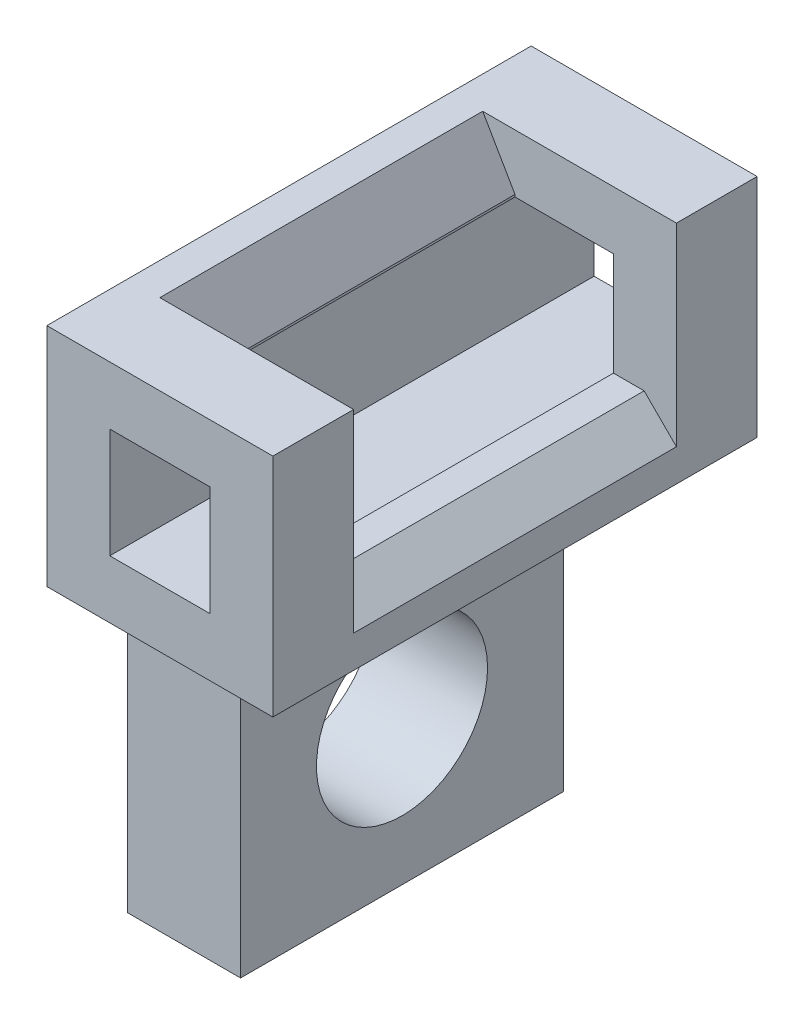
ISO-10303-21;
HEADER;
FILE_DESCRIPTION(('STEP AP214'),'2;1');
FILE_NAME('part.step','',(''),(''),'','','');
FILE_SCHEMA(('AUTOMOTIVE_DESIGN { 1 0 10303 214 1 1 1 1 }'));
ENDSEC;
DATA;
#1=APPLICATION_CONTEXT('core data for automotive mechanical design processes');
#2=APPLICATION_PROTOCOL_DEFINITION('international standard','automotive_design',2000,#1);
#3=PRODUCT_CONTEXT('',#1,'mechanical');
#4=PRODUCT('Part','Part','',(#3));
#5=PRODUCT_RELATED_PRODUCT_CATEGORY('part','',(#4));
#6=PRODUCT_DEFINITION_FORMATION('','',#4);
#7=PRODUCT_DEFINITION_CONTEXT('part definition',#1,'design');
#8=PRODUCT_DEFINITION('design','',#6,#7);
#9=PRODUCT_DEFINITION_SHAPE('','',#8);
#10=(LENGTH_UNIT() NAMED_UNIT(*) SI_UNIT(.MILLI.,.METRE.));
#11=(NAMED_UNIT(*) PLANE_ANGLE_UNIT() SI_UNIT($,.RADIAN.));
#12=(NAMED_UNIT(*) SI_UNIT($,.STERADIAN.) SOLID_ANGLE_UNIT());
#13=UNCERTAINTY_MEASURE_WITH_UNIT(LENGTH_MEASURE(1.E-05),#10,'distance_accuracy_value','');
#14=(GEOMETRIC_REPRESENTATION_CONTEXT(3) GLOBAL_UNCERTAINTY_ASSIGNED_CONTEXT((#13)) GLOBAL_UNIT_ASSIGNED_CONTEXT((#10,
#11,#12)) REPRESENTATION_CONTEXT('',''));
#15=CARTESIAN_POINT('',(0.,0.,0.));
#16=DIRECTION('',(0.,0.,1.));
#17=DIRECTION('',(1.,0.,0.));
#18=AXIS2_PLACEMENT_3D('',#15,#16,#17);
#19=CARTESIAN_POINT('',(-3.5,-3.5,15.));
#20=DIRECTION('',(0.,1.,0.));
#21=DIRECTION('',(0.,0.,1.));
#22=AXIS2_PLACEMENT_3D('',#19,#20,#21);
#23=PLANE('',#22);
#24=DIRECTION('',(0.,0.,-1.));
#25=VECTOR('',#24,1.);
#26=CARTESIAN_POINT('',(0.999999999999997,-3.5,2.5));
#27=LINE('',#26,#25);
#28=CARTESIAN_POINT('',(0.999999999999995,-3.5,13.5));
#29=VERTEX_POINT('',#28);
#30=CARTESIAN_POINT('',(0.999999999999997,-3.5,1.50000000000001));
#31=VERTEX_POINT('',#30);
#32=EDGE_CURVE('E390',#29,#31,#27,.T.);
#33=ORIENTED_EDGE('',*,*,#32,.T.);
#34=DIRECTION('',(-1.,0.,0.));
#35=VECTOR('',#34,1.);
#36=CARTESIAN_POINT('',(-3.5,-3.5,1.50000000000001));
#37=LINE('',#36,#35);
#38=CARTESIAN_POINT('',(-3.5,-3.5,1.50000000000001));
#39=VERTEX_POINT('',#38);
#40=EDGE_CURVE('E393',#31,#39,#37,.T.);
#41=ORIENTED_EDGE('',*,*,#40,.T.);
#42=DIRECTION('',(0.,0.,-1.));
#43=VECTOR('',#42,1.);
#44=CARTESIAN_POINT('',(-3.5,-3.5,15.));
#45=LINE('',#44,#43);
#46=CARTESIAN_POINT('',(-3.5,-3.5,0.));
#47=VERTEX_POINT('',#46);
#48=EDGE_CURVE('E340',#39,#47,#45,.T.);
#49=ORIENTED_EDGE('',*,*,#48,.T.);
#50=DIRECTION('',(1.,0.,0.));
#51=VECTOR('',#50,1.);
#52=CARTESIAN_POINT('',(-3.5,-3.5,0.));
#53=LINE('',#52,#51);
#54=CARTESIAN_POINT('',(3.5,-3.5,0.));
#55=VERTEX_POINT('',#54);
#56=EDGE_CURVE('E316',#47,#55,#53,.T.);
#57=ORIENTED_EDGE('',*,*,#56,.T.);
#58=DIRECTION('',(0.,0.,-1.));
#59=VECTOR('',#58,1.);
#60=CARTESIAN_POINT('',(3.5,-3.5,15.));
#61=LINE('',#60,#59);
#62=CARTESIAN_POINT('',(3.5,-3.5,15.));
#63=VERTEX_POINT('',#62);
#64=EDGE_CURVE('E325',#63,#55,#61,.T.);
#65=ORIENTED_EDGE('',*,*,#64,.F.);
#66=DIRECTION('',(1.,0.,0.));
#67=VECTOR('',#66,1.);
#68=CARTESIAN_POINT('',(-3.5,-3.5,15.));
#69=LINE('',#68,#67);
#70=CARTESIAN_POINT('',(-3.5,-3.5,15.));
#71=VERTEX_POINT('',#70);
#72=EDGE_CURVE('E322',#71,#63,#69,.T.);
#73=ORIENTED_EDGE('',*,*,#72,.F.);
#74=CARTESIAN_POINT('',(-3.5,-3.5,13.5));
#75=VERTEX_POINT('',#74);
#76=EDGE_CURVE('E341',#71,#75,#45,.T.);
#77=ORIENTED_EDGE('',*,*,#76,.T.);
#78=DIRECTION('',(1.,0.,0.));
#79=VECTOR('',#78,1.);
#80=CARTESIAN_POINT('',(0.,-3.5,13.5));
#81=LINE('',#80,#79);
#82=EDGE_CURVE('E387',#75,#29,#81,.T.);
#83=ORIENTED_EDGE('',*,*,#82,.T.);
#84=EDGE_LOOP('',(#33,#41,#49,#57,#65,#73,#77,#83));
#85=FACE_BOUND('',#84,.T.);
#86=ADVANCED_FACE('F44',(#85),#23,.F.);
#87=CARTESIAN_POINT('',(3.5,3.5,15.));
#88=DIRECTION('',(-1.,0.,0.));
#89=DIRECTION('',(0.,-1.,0.));
#90=AXIS2_PLACEMENT_3D('',#87,#88,#89);
#91=PLANE('',#90);
#92=DIRECTION('',(0.,1.,0.));
#93=VECTOR('',#92,1.);
#94=CARTESIAN_POINT('',(3.5,-1.5,2.5));
#95=LINE('',#94,#93);
#96=CARTESIAN_POINT('',(3.5,-2.5,2.5));
#97=VERTEX_POINT('',#96);
#98=CARTESIAN_POINT('',(3.5,3.5,2.5));
#99=VERTEX_POINT('',#98);
#100=EDGE_CURVE('E61',#97,#99,#95,.T.);
#101=ORIENTED_EDGE('',*,*,#100,.F.);
#102=DIRECTION('',(0.,0.,1.));
#103=VECTOR('',#102,1.);
#104=CARTESIAN_POINT('',(3.5,-2.5,12.5));
#105=LINE('',#104,#103);
#106=CARTESIAN_POINT('',(3.5,-2.5,12.5));
#107=VERTEX_POINT('',#106);
#108=EDGE_CURVE('E418',#97,#107,#105,.T.);
#109=ORIENTED_EDGE('',*,*,#108,.T.);
#110=DIRECTION('',(0.,1.,0.));
#111=VECTOR('',#110,1.);
#112=CARTESIAN_POINT('',(3.5,-1.5,12.5));
#113=LINE('',#112,#111);
#114=CARTESIAN_POINT('',(3.5,3.5,12.5));
#115=VERTEX_POINT('',#114);
#116=EDGE_CURVE('E68',#107,#115,#113,.T.);
#117=ORIENTED_EDGE('',*,*,#116,.T.);
#118=DIRECTION('',(0.,0.,-1.));
#119=VECTOR('',#118,1.);
#120=CARTESIAN_POINT('',(3.5,3.5,15.));
#121=LINE('',#120,#119);
#122=CARTESIAN_POINT('',(3.5,3.5,15.));
#123=VERTEX_POINT('',#122);
#124=EDGE_CURVE('E350',#123,#115,#121,.T.);
#125=ORIENTED_EDGE('',*,*,#124,.F.);
#126=DIRECTION('',(0.,1.,0.));
#127=VECTOR('',#126,1.);
#128=CARTESIAN_POINT('',(3.5,3.5,15.));
#129=LINE('',#128,#127);
#130=EDGE_CURVE('E311',#63,#123,#129,.T.);
#131=ORIENTED_EDGE('',*,*,#130,.F.);
#132=ORIENTED_EDGE('',*,*,#64,.T.);
#133=DIRECTION('',(0.,1.,0.));
#134=VECTOR('',#133,1.);
#135=CARTESIAN_POINT('',(3.5,3.5,0.));
#136=LINE('',#135,#134);
#137=CARTESIAN_POINT('',(3.5,3.5,0.));
#138=VERTEX_POINT('',#137);
#139=EDGE_CURVE('E300',#55,#138,#136,.T.);
#140=ORIENTED_EDGE('',*,*,#139,.T.);
#141=EDGE_CURVE('E349',#99,#138,#121,.T.);
#142=ORIENTED_EDGE('',*,*,#141,.F.);
#143=EDGE_LOOP('',(#101,#109,#117,#125,#131,#132,#140,#142));
#144=FACE_BOUND('',#143,.T.);
#145=ADVANCED_FACE('F430',(#144),#91,.F.);
#146=CARTESIAN_POINT('',(-3.5,3.5,15.));
#147=DIRECTION('',(0.,-1.,0.));
#148=DIRECTION('',(0.,0.,-1.));
#149=AXIS2_PLACEMENT_3D('',#146,#147,#148);
#150=PLANE('',#149);
#151=DIRECTION('',(1.,0.,0.));
#152=VECTOR('',#151,1.);
#153=CARTESIAN_POINT('',(-1.5,3.5,12.5));
#154=LINE('',#153,#152);
#155=CARTESIAN_POINT('',(-2.5,3.5,12.5));
#156=VERTEX_POINT('',#155);
#157=EDGE_CURVE('E229',#156,#115,#154,.T.);
#158=ORIENTED_EDGE('',*,*,#157,.F.);
#159=DIRECTION('',(0.,0.,-1.));
#160=VECTOR('',#159,1.);
#161=CARTESIAN_POINT('',(-2.5,3.5,15.));
#162=LINE('',#161,#160);
#163=CARTESIAN_POINT('',(-2.5,3.5,2.5));
#164=VERTEX_POINT('',#163);
#165=EDGE_CURVE('E373',#156,#164,#162,.T.);
#166=ORIENTED_EDGE('',*,*,#165,.T.);
#167=DIRECTION('',(-1.,0.,0.));
#168=VECTOR('',#167,1.);
#169=CARTESIAN_POINT('',(-1.5,3.5,2.5));
#170=LINE('',#169,#168);
#171=EDGE_CURVE('E225',#99,#164,#170,.T.);
#172=ORIENTED_EDGE('',*,*,#171,.F.);
#173=ORIENTED_EDGE('',*,*,#141,.T.);
#174=DIRECTION('',(-1.,0.,0.));
#175=VECTOR('',#174,1.);
#176=CARTESIAN_POINT('',(-3.5,3.5,0.));
#177=LINE('',#176,#175);
#178=CARTESIAN_POINT('',(-3.5,3.5,0.));
#179=VERTEX_POINT('',#178);
#180=EDGE_CURVE('E329',#138,#179,#177,.T.);
#181=ORIENTED_EDGE('',*,*,#180,.T.);
#182=DIRECTION('',(0.,0.,-1.));
#183=VECTOR('',#182,1.);
#184=CARTESIAN_POINT('',(-3.5,3.5,15.));
#185=LINE('',#184,#183);
#186=CARTESIAN_POINT('',(-3.5,3.5,15.));
#187=VERTEX_POINT('',#186);
#188=EDGE_CURVE('E345',#187,#179,#185,.T.);
#189=ORIENTED_EDGE('',*,*,#188,.F.);
#190=DIRECTION('',(-1.,0.,0.));
#191=VECTOR('',#190,1.);
#192=CARTESIAN_POINT('',(-3.5,3.5,15.));
#193=LINE('',#192,#191);
#194=EDGE_CURVE('E315',#123,#187,#193,.T.);
#195=ORIENTED_EDGE('',*,*,#194,.F.);
#196=ORIENTED_EDGE('',*,*,#124,.T.);
#197=EDGE_LOOP('',(#158,#166,#172,#173,#181,#189,#195,#196));
#198=FACE_BOUND('',#197,.T.);
#199=ADVANCED_FACE('F434',(#198),#150,.F.);
#200=CARTESIAN_POINT('',(-3.5,3.5,15.));
#201=DIRECTION('',(1.,0.,0.));
#202=DIRECTION('',(0.,1.,0.));
#203=AXIS2_PLACEMENT_3D('',#200,#201,#202);
#204=PLANE('',#203);
#205=CARTESIAN_POINT('',(-3.5,-9.,7.5));
#206=DIRECTION('',(1.,0.,0.));
#207=DIRECTION('',(0.,1.,0.));
#208=AXIS2_PLACEMENT_3D('',#205,#206,#207);
#209=CIRCLE('',#208,2.65);
#210=CARTESIAN_POINT('',(-3.5,-6.35,7.5));
#211=VERTEX_POINT('',#210);
#212=EDGE_CURVE('E411',#211,#211,#209,.T.);
#213=ORIENTED_EDGE('',*,*,#212,.T.);
#214=EDGE_LOOP('',(#213));
#215=FACE_BOUND('',#214,.T.);
#216=DIRECTION('',(0.,-1.,0.));
#217=VECTOR('',#216,1.);
#218=CARTESIAN_POINT('',(-3.5,3.5,0.));
#219=LINE('',#218,#217);
#220=EDGE_CURVE('E332',#179,#47,#219,.T.);
#221=ORIENTED_EDGE('',*,*,#220,.T.);
#222=ORIENTED_EDGE('',*,*,#48,.F.);
#223=DIRECTION('',(0.,0.707106781186551,-0.707106781186544));
#224=VECTOR('',#223,1.);
#225=CARTESIAN_POINT('',(-3.5,-6.74999999999996,4.74999999999994));
#226=LINE('',#225,#224);
#227=CARTESIAN_POINT('',(-3.5,-4.5,2.5));
#228=VERTEX_POINT('',#227);
#229=EDGE_CURVE('E223',#39,#228,#226,.F.);
#230=ORIENTED_EDGE('',*,*,#229,.T.);
#231=DIRECTION('',(0.,1.,0.));
#232=VECTOR('',#231,1.);
#233=CARTESIAN_POINT('',(-3.5,-13.5,2.5));
#234=LINE('',#233,#232);
#235=CARTESIAN_POINT('',(-3.5,-13.5,2.5));
#236=VERTEX_POINT('',#235);
#237=EDGE_CURVE('E199',#236,#228,#234,.T.);
#238=ORIENTED_EDGE('',*,*,#237,.F.);
#239=DIRECTION('',(0.,0.,-1.));
#240=VECTOR('',#239,1.);
#241=CARTESIAN_POINT('',(-3.5,-13.5,12.5));
#242=LINE('',#241,#240);
#243=CARTESIAN_POINT('',(-3.5,-13.5,12.5));
#244=VERTEX_POINT('',#243);
#245=EDGE_CURVE('E207',#244,#236,#242,.T.);
#246=ORIENTED_EDGE('',*,*,#245,.F.);
#247=DIRECTION('',(0.,1.,0.));
#248=VECTOR('',#247,1.);
#249=CARTESIAN_POINT('',(-3.5,-13.5,12.5));
#250=LINE('',#249,#248);
#251=CARTESIAN_POINT('',(-3.5,-4.5,12.5));
#252=VERTEX_POINT('',#251);
#253=EDGE_CURVE('E771',#244,#252,#250,.T.);
#254=ORIENTED_EDGE('',*,*,#253,.T.);
#255=DIRECTION('',(0.,-0.707106781186551,-0.707106781186544));
#256=VECTOR('',#255,1.);
#257=CARTESIAN_POINT('',(-3.5,0.750000000000039,17.75));
#258=LINE('',#257,#256);
#259=EDGE_CURVE('E404',#252,#75,#258,.F.);
#260=ORIENTED_EDGE('',*,*,#259,.T.);
#261=ORIENTED_EDGE('',*,*,#76,.F.);
#262=DIRECTION('',(0.,-1.,0.));
#263=VECTOR('',#262,1.);
#264=CARTESIAN_POINT('',(-3.5,3.5,15.));
#265=LINE('',#264,#263);
#266=EDGE_CURVE('E319',#187,#71,#265,.T.);
#267=ORIENTED_EDGE('',*,*,#266,.F.);
#268=ORIENTED_EDGE('',*,*,#188,.T.);
#269=EDGE_LOOP('',(#221,#222,#230,#238,#246,#254,#260,#261,#267,#268));
#270=FACE_BOUND('',#269,.T.);
#271=ADVANCED_FACE('F220',(#215,#270),#204,.F.);
#272=CARTESIAN_POINT('',(0.,0.,15.));
#273=DIRECTION('',(0.,0.,1.));
#274=DIRECTION('',(1.,0.,0.));
#275=AXIS2_PLACEMENT_3D('',#272,#273,#274);
#276=PLANE('',#275);
#277=DIRECTION('',(0.,1.,0.));
#278=VECTOR('',#277,1.);
#279=CARTESIAN_POINT('',(1.55,1.7,15.));
#280=LINE('',#279,#278);
#281=CARTESIAN_POINT('',(1.55,-1.7,15.));
#282=VERTEX_POINT('',#281);
#283=CARTESIAN_POINT('',(1.55,1.7,15.));
#284=VERTEX_POINT('',#283);
#285=EDGE_CURVE('E264',#282,#284,#280,.T.);
#286=ORIENTED_EDGE('',*,*,#285,.F.);
#287=DIRECTION('',(1.,0.,0.));
#288=VECTOR('',#287,1.);
#289=CARTESIAN_POINT('',(-1.55,-1.7,15.));
#290=LINE('',#289,#288);
#291=CARTESIAN_POINT('',(-1.55,-1.7,15.));
#292=VERTEX_POINT('',#291);
#293=EDGE_CURVE('E270',#292,#282,#290,.T.);
#294=ORIENTED_EDGE('',*,*,#293,.F.);
#295=DIRECTION('',(0.,-1.,0.));
#296=VECTOR('',#295,1.);
#297=CARTESIAN_POINT('',(-1.55,1.7,15.));
#298=LINE('',#297,#296);
#299=CARTESIAN_POINT('',(-1.55,1.7,15.));
#300=VERTEX_POINT('',#299);
#301=EDGE_CURVE('E290',#300,#292,#298,.T.);
#302=ORIENTED_EDGE('',*,*,#301,.F.);
#303=DIRECTION('',(-1.,0.,0.));
#304=VECTOR('',#303,1.);
#305=CARTESIAN_POINT('',(-1.55,1.7,15.));
#306=LINE('',#305,#304);
#307=EDGE_CURVE('E286',#284,#300,#306,.T.);
#308=ORIENTED_EDGE('',*,*,#307,.F.);
#309=EDGE_LOOP('',(#286,#294,#302,#308));
#310=FACE_BOUND('',#309,.T.);
#311=ORIENTED_EDGE('',*,*,#130,.T.);
#312=ORIENTED_EDGE('',*,*,#194,.T.);
#313=ORIENTED_EDGE('',*,*,#266,.T.);
#314=ORIENTED_EDGE('',*,*,#72,.T.);
#315=EDGE_LOOP('',(#311,#312,#313,#314));
#316=FACE_BOUND('',#315,.T.);
#317=ADVANCED_FACE('F438',(#310,#316),#276,.T.);
#318=CARTESIAN_POINT('',(0.,0.,0.));
#319=DIRECTION('',(0.,0.,1.));
#320=DIRECTION('',(1.,0.,0.));
#321=AXIS2_PLACEMENT_3D('',#318,#319,#320);
#322=PLANE('',#321);
#323=DIRECTION('',(1.,0.,0.));
#324=VECTOR('',#323,1.);
#325=CARTESIAN_POINT('',(-1.55,-1.7,0.));
#326=LINE('',#325,#324);
#327=CARTESIAN_POINT('',(-1.55,-1.7,0.));
#328=VERTEX_POINT('',#327);
#329=CARTESIAN_POINT('',(1.55,-1.7,0.));
#330=VERTEX_POINT('',#329);
#331=EDGE_CURVE('E278',#328,#330,#326,.T.);
#332=ORIENTED_EDGE('',*,*,#331,.T.);
#333=DIRECTION('',(0.,1.,0.));
#334=VECTOR('',#333,1.);
#335=CARTESIAN_POINT('',(1.55,1.7,0.));
#336=LINE('',#335,#334);
#337=CARTESIAN_POINT('',(1.55,1.7,0.));
#338=VERTEX_POINT('',#337);
#339=EDGE_CURVE('E265',#330,#338,#336,.T.);
#340=ORIENTED_EDGE('',*,*,#339,.T.);
#341=DIRECTION('',(-1.,0.,0.));
#342=VECTOR('',#341,1.);
#343=CARTESIAN_POINT('',(-1.55,1.7,0.));
#344=LINE('',#343,#342);
#345=CARTESIAN_POINT('',(-1.55,1.7,0.));
#346=VERTEX_POINT('',#345);
#347=EDGE_CURVE('E269',#338,#346,#344,.T.);
#348=ORIENTED_EDGE('',*,*,#347,.T.);
#349=DIRECTION('',(0.,-1.,0.));
#350=VECTOR('',#349,1.);
#351=CARTESIAN_POINT('',(-1.55,1.7,0.));
#352=LINE('',#351,#350);
#353=EDGE_CURVE('E274',#346,#328,#352,.T.);
#354=ORIENTED_EDGE('',*,*,#353,.T.);
#355=EDGE_LOOP('',(#332,#340,#348,#354));
#356=FACE_BOUND('',#355,.T.);
#357=ORIENTED_EDGE('',*,*,#139,.F.);
#358=ORIENTED_EDGE('',*,*,#56,.F.);
#359=ORIENTED_EDGE('',*,*,#220,.F.);
#360=ORIENTED_EDGE('',*,*,#180,.F.);
#361=EDGE_LOOP('',(#357,#358,#359,#360));
#362=FACE_BOUND('',#361,.T.);
#363=ADVANCED_FACE('F446',(#356,#362),#322,.F.);
#364=CARTESIAN_POINT('',(1.55,1.7,0.));
#365=DIRECTION('',(1.,0.,0.));
#366=DIRECTION('',(0.,1.,0.));
#367=AXIS2_PLACEMENT_3D('',#364,#365,#366);
#368=PLANE('',#367);
#369=DIRECTION('',(0.,0.,1.));
#370=VECTOR('',#369,1.);
#371=CARTESIAN_POINT('',(1.55,1.7,0.));
#372=LINE('',#371,#370);
#373=CARTESIAN_POINT('',(1.55,1.7,12.5));
#374=VERTEX_POINT('',#373);
#375=EDGE_CURVE('E282',#374,#284,#372,.T.);
#376=ORIENTED_EDGE('',*,*,#375,.F.);
#377=DIRECTION('',(0.,-1.,0.));
#378=VECTOR('',#377,1.);
#379=CARTESIAN_POINT('',(1.55,1.7,12.5));
#380=LINE('',#379,#378);
#381=CARTESIAN_POINT('',(1.55,-1.5,12.5));
#382=VERTEX_POINT('',#381);
#383=EDGE_CURVE('E260',#374,#382,#380,.T.);
#384=ORIENTED_EDGE('',*,*,#383,.T.);
#385=DIRECTION('',(0.,0.,1.));
#386=VECTOR('',#385,1.);
#387=CARTESIAN_POINT('',(1.55,-1.5,0.));
#388=LINE('',#387,#386);
#389=CARTESIAN_POINT('',(1.55,-1.5,2.5));
#390=VERTEX_POINT('',#389);
#391=EDGE_CURVE('E366',#390,#382,#388,.T.);
#392=ORIENTED_EDGE('',*,*,#391,.F.);
#393=DIRECTION('',(0.,1.,0.));
#394=VECTOR('',#393,1.);
#395=CARTESIAN_POINT('',(1.55,1.7,2.5));
#396=LINE('',#395,#394);
#397=CARTESIAN_POINT('',(1.55,1.7,2.5));
#398=VERTEX_POINT('',#397);
#399=EDGE_CURVE('E246',#390,#398,#396,.T.);
#400=ORIENTED_EDGE('',*,*,#399,.T.);
#401=EDGE_CURVE('E307',#338,#398,#372,.T.);
#402=ORIENTED_EDGE('',*,*,#401,.F.);
#403=ORIENTED_EDGE('',*,*,#339,.F.);
#404=DIRECTION('',(0.,0.,1.));
#405=VECTOR('',#404,1.);
#406=CARTESIAN_POINT('',(1.55,-1.7,0.));
#407=LINE('',#406,#405);
#408=EDGE_CURVE('E297',#330,#282,#407,.T.);
#409=ORIENTED_EDGE('',*,*,#408,.T.);
#410=ORIENTED_EDGE('',*,*,#285,.T.);
#411=EDGE_LOOP('',(#376,#384,#392,#400,#402,#403,#409,#410));
#412=FACE_BOUND('',#411,.T.);
#413=ADVANCED_FACE('F514',(#412),#368,.F.);
#414=CARTESIAN_POINT('',(-1.55,-1.7,0.));
#415=DIRECTION('',(0.,-1.,0.));
#416=DIRECTION('',(0.,0.,-1.));
#417=AXIS2_PLACEMENT_3D('',#414,#415,#416);
#418=PLANE('',#417);
#419=ORIENTED_EDGE('',*,*,#293,.T.);
#420=ORIENTED_EDGE('',*,*,#408,.F.);
#421=ORIENTED_EDGE('',*,*,#331,.F.);
#422=DIRECTION('',(0.,0.,1.));
#423=VECTOR('',#422,1.);
#424=CARTESIAN_POINT('',(-1.55,-1.7,0.));
#425=LINE('',#424,#423);
#426=EDGE_CURVE('E301',#328,#292,#425,.T.);
#427=ORIENTED_EDGE('',*,*,#426,.T.);
#428=EDGE_LOOP('',(#419,#420,#421,#427));
#429=FACE_BOUND('',#428,.T.);
#430=ADVANCED_FACE('F550',(#429),#418,.F.);
#431=CARTESIAN_POINT('',(-1.55,1.7,0.));
#432=DIRECTION('',(-1.,0.,0.));
#433=DIRECTION('',(0.,-1.,0.));
#434=AXIS2_PLACEMENT_3D('',#431,#432,#433);
#435=PLANE('',#434);
#436=ORIENTED_EDGE('',*,*,#301,.T.);
#437=ORIENTED_EDGE('',*,*,#426,.F.);
#438=ORIENTED_EDGE('',*,*,#353,.F.);
#439=DIRECTION('',(0.,0.,1.));
#440=VECTOR('',#439,1.);
#441=CARTESIAN_POINT('',(-1.55,1.7,0.));
#442=LINE('',#441,#440);
#443=EDGE_CURVE('E304',#346,#300,#442,.T.);
#444=ORIENTED_EDGE('',*,*,#443,.T.);
#445=EDGE_LOOP('',(#436,#437,#438,#444));
#446=FACE_BOUND('',#445,.T.);
#447=ADVANCED_FACE('F519',(#446),#435,.F.);
#448=CARTESIAN_POINT('',(-1.55,1.7,0.));
#449=DIRECTION('',(0.,1.,0.));
#450=DIRECTION('',(0.,0.,1.));
#451=AXIS2_PLACEMENT_3D('',#448,#449,#450);
#452=PLANE('',#451);
#453=DIRECTION('',(0.,0.,1.));
#454=VECTOR('',#453,1.);
#455=CARTESIAN_POINT('',(-1.5,1.7,0.));
#456=LINE('',#455,#454);
#457=CARTESIAN_POINT('',(-1.5,1.7,2.5));
#458=VERTEX_POINT('',#457);
#459=CARTESIAN_POINT('',(-1.5,1.7,12.5));
#460=VERTEX_POINT('',#459);
#461=EDGE_CURVE('E358',#458,#460,#456,.T.);
#462=ORIENTED_EDGE('',*,*,#461,.T.);
#463=DIRECTION('',(1.,0.,0.));
#464=VECTOR('',#463,1.);
#465=CARTESIAN_POINT('',(-1.55,1.7,12.5));
#466=LINE('',#465,#464);
#467=EDGE_CURVE('E362',#460,#374,#466,.T.);
#468=ORIENTED_EDGE('',*,*,#467,.T.);
#469=ORIENTED_EDGE('',*,*,#375,.T.);
#470=ORIENTED_EDGE('',*,*,#307,.T.);
#471=ORIENTED_EDGE('',*,*,#443,.F.);
#472=ORIENTED_EDGE('',*,*,#347,.F.);
#473=ORIENTED_EDGE('',*,*,#401,.T.);
#474=DIRECTION('',(-1.,0.,0.));
#475=VECTOR('',#474,1.);
#476=CARTESIAN_POINT('',(-1.55,1.7,2.5));
#477=LINE('',#476,#475);
#478=EDGE_CURVE('E354',#398,#458,#477,.T.);
#479=ORIENTED_EDGE('',*,*,#478,.T.);
#480=EDGE_LOOP('',(#462,#468,#469,#470,#471,#472,#473,#479));
#481=FACE_BOUND('',#480,.T.);
#482=ADVANCED_FACE('F508',(#481),#452,.F.);
#483=CARTESIAN_POINT('',(0.,-1.5,0.));
#484=DIRECTION('',(0.,1.,0.));
#485=DIRECTION('',(0.,0.,1.));
#486=AXIS2_PLACEMENT_3D('',#483,#484,#485);
#487=PLANE('',#486);
#488=DIRECTION('',(1.,0.,0.));
#489=VECTOR('',#488,1.);
#490=CARTESIAN_POINT('',(-1.5,-1.5,12.5));
#491=LINE('',#490,#489);
#492=CARTESIAN_POINT('',(2.5,-1.5,12.5));
#493=VERTEX_POINT('',#492);
#494=EDGE_CURVE('E238',#382,#493,#491,.T.);
#495=ORIENTED_EDGE('',*,*,#494,.T.);
#496=DIRECTION('',(0.,0.,-1.));
#497=VECTOR('',#496,1.);
#498=CARTESIAN_POINT('',(2.5,-1.5,2.5));
#499=LINE('',#498,#497);
#500=CARTESIAN_POINT('',(2.5,-1.5,2.5));
#501=VERTEX_POINT('',#500);
#502=EDGE_CURVE('E407',#493,#501,#499,.T.);
#503=ORIENTED_EDGE('',*,*,#502,.T.);
#504=DIRECTION('',(-1.,0.,0.));
#505=VECTOR('',#504,1.);
#506=CARTESIAN_POINT('',(-1.5,-1.5,2.5));
#507=LINE('',#506,#505);
#508=EDGE_CURVE('E235',#501,#390,#507,.T.);
#509=ORIENTED_EDGE('',*,*,#508,.T.);
#510=ORIENTED_EDGE('',*,*,#391,.T.);
#511=EDGE_LOOP('',(#495,#503,#509,#510));
#512=FACE_BOUND('',#511,.T.);
#513=ADVANCED_FACE('F534',(#512),#487,.T.);
#514=CARTESIAN_POINT('',(-1.5,-1.5,12.5));
#515=DIRECTION('',(0.,0.,1.));
#516=DIRECTION('',(1.,0.,0.));
#517=AXIS2_PLACEMENT_3D('',#514,#515,#516);
#518=PLANE('',#517);
#519=ORIENTED_EDGE('',*,*,#467,.F.);
#520=DIRECTION('',(0.,1.,0.));
#521=VECTOR('',#520,1.);
#522=CARTESIAN_POINT('',(-1.5,-1.5,12.5));
#523=LINE('',#522,#521);
#524=CARTESIAN_POINT('',(-1.5,1.76794919243112,12.5));
#525=VERTEX_POINT('',#524);
#526=EDGE_CURVE('E247',#460,#525,#523,.T.);
#527=ORIENTED_EDGE('',*,*,#526,.T.);
#528=DIRECTION('',(0.500000000000001,-0.866025403784438,0.));
#529=VECTOR('',#528,1.);
#530=CARTESIAN_POINT('',(-0.0849364905389002,-0.683012701892216,12.5));
#531=LINE('',#530,#529);
#532=EDGE_CURVE('E377',#525,#156,#531,.F.);
#533=ORIENTED_EDGE('',*,*,#532,.T.);
#534=ORIENTED_EDGE('',*,*,#157,.T.);
#535=ORIENTED_EDGE('',*,*,#116,.F.);
#536=DIRECTION('',(-0.707106781186546,0.707106781186549,0.));
#537=VECTOR('',#536,1.);
#538=CARTESIAN_POINT('',(0.500000000000008,0.500000000000001,12.5));
#539=LINE('',#538,#537);
#540=EDGE_CURVE('E11',#107,#493,#539,.T.);
#541=ORIENTED_EDGE('',*,*,#540,.T.);
#542=ORIENTED_EDGE('',*,*,#494,.F.);
#543=ORIENTED_EDGE('',*,*,#383,.F.);
#544=EDGE_LOOP('',(#519,#527,#533,#534,#535,#541,#542,#543));
#545=FACE_BOUND('',#544,.T.);
#546=ADVANCED_FACE('F530',(#545),#518,.F.);
#547=CARTESIAN_POINT('',(-1.5,-1.5,2.5));
#548=DIRECTION('',(-1.,0.,0.));
#549=DIRECTION('',(0.,0.,1.));
#550=AXIS2_PLACEMENT_3D('',#547,#548,#549);
#551=PLANE('',#550);
#552=DIRECTION('',(0.,1.,0.));
#553=VECTOR('',#552,1.);
#554=CARTESIAN_POINT('',(-1.5,-1.5,2.5));
#555=LINE('',#554,#553);
#556=CARTESIAN_POINT('',(-1.5,1.76794919243112,2.5));
#557=VERTEX_POINT('',#556);
#558=EDGE_CURVE('E251',#458,#557,#555,.T.);
#559=ORIENTED_EDGE('',*,*,#558,.T.);
#560=DIRECTION('',(0.,0.,1.));
#561=VECTOR('',#560,1.);
#562=CARTESIAN_POINT('',(-1.5,1.76794919243112,2.5));
#563=LINE('',#562,#561);
#564=EDGE_CURVE('E369',#557,#525,#563,.T.);
#565=ORIENTED_EDGE('',*,*,#564,.T.);
#566=ORIENTED_EDGE('',*,*,#526,.F.);
#567=ORIENTED_EDGE('',*,*,#461,.F.);
#568=EDGE_LOOP('',(#559,#565,#566,#567));
#569=FACE_BOUND('',#568,.T.);
#570=ADVANCED_FACE('F529',(#569),#551,.F.);
#571=CARTESIAN_POINT('',(-1.5,-1.5,2.5));
#572=DIRECTION('',(0.,0.,-1.));
#573=DIRECTION('',(-1.,0.,0.));
#574=AXIS2_PLACEMENT_3D('',#571,#572,#573);
#575=PLANE('',#574);
#576=ORIENTED_EDGE('',*,*,#508,.F.);
#577=DIRECTION('',(0.707106781186546,-0.707106781186549,0.));
#578=VECTOR('',#577,1.);
#579=CARTESIAN_POINT('',(0.500000000000008,0.500000000000001,2.5));
#580=LINE('',#579,#578);
#581=EDGE_CURVE('E54',#501,#97,#580,.T.);
#582=ORIENTED_EDGE('',*,*,#581,.T.);
#583=ORIENTED_EDGE('',*,*,#100,.T.);
#584=ORIENTED_EDGE('',*,*,#171,.T.);
#585=DIRECTION('',(-0.500000000000001,0.866025403784438,0.));
#586=VECTOR('',#585,1.);
#587=CARTESIAN_POINT('',(-0.0849364905389002,-0.683012701892216,2.5));
#588=LINE('',#587,#586);
#589=EDGE_CURVE('E381',#164,#557,#588,.F.);
#590=ORIENTED_EDGE('',*,*,#589,.T.);
#591=ORIENTED_EDGE('',*,*,#558,.F.);
#592=ORIENTED_EDGE('',*,*,#478,.F.);
#593=ORIENTED_EDGE('',*,*,#399,.F.);
#594=EDGE_LOOP('',(#576,#582,#583,#584,#590,#591,#592,#593));
#595=FACE_BOUND('',#594,.T.);
#596=ADVANCED_FACE('F424',(#595),#575,.F.);
#597=CARTESIAN_POINT('',(-1.5,1.76794919243112,2.5));
#598=DIRECTION('',(-0.866025403784438,-0.500000000000001,0.));
#599=DIRECTION('',(0.,0.,1.));
#600=AXIS2_PLACEMENT_3D('',#597,#598,#599);
#601=PLANE('',#600);
#602=ORIENTED_EDGE('',*,*,#589,.F.);
#603=ORIENTED_EDGE('',*,*,#165,.F.);
#604=ORIENTED_EDGE('',*,*,#532,.F.);
#605=ORIENTED_EDGE('',*,*,#564,.F.);
#606=EDGE_LOOP('',(#602,#603,#604,#605));
#607=FACE_BOUND('',#606,.T.);
#608=ADVANCED_FACE('F469',(#607),#601,.F.);
#609=CARTESIAN_POINT('',(-3.5,-13.5,2.5));
#610=DIRECTION('',(0.,0.,1.));
#611=DIRECTION('',(1.,0.,0.));
#612=AXIS2_PLACEMENT_3D('',#609,#610,#611);
#613=PLANE('',#612);
#614=ORIENTED_EDGE('',*,*,#237,.T.);
#615=DIRECTION('',(1.,0.,0.));
#616=VECTOR('',#615,1.);
#617=CARTESIAN_POINT('',(0.,-4.5,2.5));
#618=LINE('',#617,#616);
#619=CARTESIAN_POINT('',(0.,-4.5,2.5));
#620=VERTEX_POINT('',#619);
#621=EDGE_CURVE('E384',#228,#620,#618,.T.);
#622=ORIENTED_EDGE('',*,*,#621,.T.);
#623=DIRECTION('',(0.,1.,0.));
#624=VECTOR('',#623,1.);
#625=CARTESIAN_POINT('',(0.,-13.5,2.5));
#626=LINE('',#625,#624);
#627=CARTESIAN_POINT('',(0.,-13.5,2.5));
#628=VERTEX_POINT('',#627);
#629=EDGE_CURVE('E202',#628,#620,#626,.T.);
#630=ORIENTED_EDGE('',*,*,#629,.F.);
#631=DIRECTION('',(1.,0.,0.));
#632=VECTOR('',#631,1.);
#633=CARTESIAN_POINT('',(-3.5,-13.5,2.5));
#634=LINE('',#633,#632);
#635=EDGE_CURVE('E194',#236,#628,#634,.T.);
#636=ORIENTED_EDGE('',*,*,#635,.F.);
#637=EDGE_LOOP('',(#614,#622,#630,#636));
#638=FACE_BOUND('',#637,.T.);
#639=ADVANCED_FACE('F196',(#638),#613,.F.);
#640=CARTESIAN_POINT('',(0.,-13.5,12.5));
#641=DIRECTION('',(-1.,0.,0.));
#642=DIRECTION('',(0.,0.,1.));
#643=AXIS2_PLACEMENT_3D('',#640,#641,#642);
#644=PLANE('',#643);
#645=CARTESIAN_POINT('',(0.,-9.,7.5));
#646=DIRECTION('',(1.,0.,0.));
#647=DIRECTION('',(0.,0.,-1.));
#648=AXIS2_PLACEMENT_3D('',#645,#646,#647);
#649=CIRCLE('',#648,2.65);
#650=CARTESIAN_POINT('',(0.,-9.,4.85));
#651=VERTEX_POINT('',#650);
#652=EDGE_CURVE('E759',#651,#651,#649,.T.);
#653=ORIENTED_EDGE('',*,*,#652,.F.);
#654=EDGE_LOOP('',(#653));
#655=FACE_BOUND('',#654,.T.);
#656=ORIENTED_EDGE('',*,*,#629,.T.);
#657=DIRECTION('',(0.,0.,1.));
#658=VECTOR('',#657,1.);
#659=CARTESIAN_POINT('',(0.,-4.5,12.5));
#660=LINE('',#659,#658);
#661=CARTESIAN_POINT('',(0.,-4.5,12.5));
#662=VERTEX_POINT('',#661);
#663=EDGE_CURVE('E396',#620,#662,#660,.T.);
#664=ORIENTED_EDGE('',*,*,#663,.T.);
#665=DIRECTION('',(0.,1.,0.));
#666=VECTOR('',#665,1.);
#667=CARTESIAN_POINT('',(0.,-13.5,12.5));
#668=LINE('',#667,#666);
#669=CARTESIAN_POINT('',(0.,-13.5,12.5));
#670=VERTEX_POINT('',#669);
#671=EDGE_CURVE('E231',#670,#662,#668,.T.);
#672=ORIENTED_EDGE('',*,*,#671,.F.);
#673=DIRECTION('',(0.,0.,1.));
#674=VECTOR('',#673,1.);
#675=CARTESIAN_POINT('',(0.,-13.5,12.5));
#676=LINE('',#675,#674);
#677=EDGE_CURVE('E206',#628,#670,#676,.T.);
#678=ORIENTED_EDGE('',*,*,#677,.F.);
#679=EDGE_LOOP('',(#656,#664,#672,#678));
#680=FACE_BOUND('',#679,.T.);
#681=ADVANCED_FACE('F615',(#655,#680),#644,.F.);
#682=CARTESIAN_POINT('',(-3.5,-13.5,12.5));
#683=DIRECTION('',(0.,0.,-1.));
#684=DIRECTION('',(-1.,0.,0.));
#685=AXIS2_PLACEMENT_3D('',#682,#683,#684);
#686=PLANE('',#685);
#687=ORIENTED_EDGE('',*,*,#671,.T.);
#688=DIRECTION('',(-1.,0.,0.));
#689=VECTOR('',#688,1.);
#690=CARTESIAN_POINT('',(-3.5,-4.5,12.5));
#691=LINE('',#690,#689);
#692=EDGE_CURVE('E399',#662,#252,#691,.T.);
#693=ORIENTED_EDGE('',*,*,#692,.T.);
#694=ORIENTED_EDGE('',*,*,#253,.F.);
#695=DIRECTION('',(-1.,0.,0.));
#696=VECTOR('',#695,1.);
#697=CARTESIAN_POINT('',(-3.5,-13.5,12.5));
#698=LINE('',#697,#696);
#699=EDGE_CURVE('E212',#670,#244,#698,.T.);
#700=ORIENTED_EDGE('',*,*,#699,.F.);
#701=EDGE_LOOP('',(#687,#693,#694,#700));
#702=FACE_BOUND('',#701,.T.);
#703=ADVANCED_FACE('F498',(#702),#686,.F.);
#704=CARTESIAN_POINT('',(0.,-13.5,0.));
#705=DIRECTION('',(0.,-1.,0.));
#706=DIRECTION('',(0.,0.,-1.));
#707=AXIS2_PLACEMENT_3D('',#704,#705,#706);
#708=PLANE('',#707);
#709=ORIENTED_EDGE('',*,*,#245,.T.);
#710=ORIENTED_EDGE('',*,*,#635,.T.);
#711=ORIENTED_EDGE('',*,*,#677,.T.);
#712=ORIENTED_EDGE('',*,*,#699,.T.);
#713=EDGE_LOOP('',(#709,#710,#711,#712));
#714=FACE_BOUND('',#713,.T.);
#715=ADVANCED_FACE('F210',(#714),#708,.T.);
#716=CARTESIAN_POINT('',(-3.5,-4.5,12.5));
#717=DIRECTION('',(0.,-0.707106781186544,0.707106781186551));
#718=DIRECTION('',(1.,0.,0.));
#719=AXIS2_PLACEMENT_3D('',#716,#717,#718);
#720=PLANE('',#719);
#721=ORIENTED_EDGE('',*,*,#259,.F.);
#722=ORIENTED_EDGE('',*,*,#692,.F.);
#723=DIRECTION('',(0.577350269189624,0.57735026918963,0.577350269189624));
#724=VECTOR('',#723,1.);
#725=CARTESIAN_POINT('',(-1.16666666666666,-5.66666666666667,11.3333333333333));
#726=LINE('',#725,#724);
#727=EDGE_CURVE('E217',#29,#662,#726,.F.);
#728=ORIENTED_EDGE('',*,*,#727,.F.);
#729=ORIENTED_EDGE('',*,*,#82,.F.);
#730=EDGE_LOOP('',(#721,#722,#728,#729));
#731=FACE_BOUND('',#730,.T.);
#732=ADVANCED_FACE('F489',(#731),#720,.T.);
#733=CARTESIAN_POINT('',(0.,-4.5,12.5));
#734=DIRECTION('',(0.707106781186551,-0.707106781186544,0.));
#735=DIRECTION('',(0.,0.,-1.));
#736=AXIS2_PLACEMENT_3D('',#733,#734,#735);
#737=PLANE('',#736);
#738=ORIENTED_EDGE('',*,*,#727,.T.);
#739=ORIENTED_EDGE('',*,*,#663,.F.);
#740=DIRECTION('',(0.577350269189624,0.57735026918963,-0.577350269189624));
#741=VECTOR('',#740,1.);
#742=CARTESIAN_POINT('',(-3.33333333333331,-7.83333333333335,5.83333333333331));
#743=LINE('',#742,#741);
#744=EDGE_CURVE('E408',#31,#620,#743,.F.);
#745=ORIENTED_EDGE('',*,*,#744,.F.);
#746=ORIENTED_EDGE('',*,*,#32,.F.);
#747=EDGE_LOOP('',(#738,#739,#745,#746));
#748=FACE_BOUND('',#747,.T.);
#749=ADVANCED_FACE('F484',(#748),#737,.T.);
#750=CARTESIAN_POINT('',(-3.5,-4.5,2.5));
#751=DIRECTION('',(0.,-0.707106781186544,-0.707106781186551));
#752=DIRECTION('',(-1.,0.,0.));
#753=AXIS2_PLACEMENT_3D('',#750,#751,#752);
#754=PLANE('',#753);
#755=ORIENTED_EDGE('',*,*,#229,.F.);
#756=ORIENTED_EDGE('',*,*,#40,.F.);
#757=ORIENTED_EDGE('',*,*,#744,.T.);
#758=ORIENTED_EDGE('',*,*,#621,.F.);
#759=EDGE_LOOP('',(#755,#756,#757,#758));
#760=FACE_BOUND('',#759,.T.);
#761=ADVANCED_FACE('F477',(#760),#754,.T.);
#762=CARTESIAN_POINT('',(-10.,-9.,7.5));
#763=DIRECTION('',(1.,0.,0.));
#764=DIRECTION('',(0.,0.,-1.));
#765=AXIS2_PLACEMENT_3D('',#762,#763,#764);
#766=CYLINDRICAL_SURFACE('',#765,2.65);
#767=ORIENTED_EDGE('',*,*,#652,.T.);
#768=EDGE_LOOP('',(#767));
#769=FACE_BOUND('',#768,.T.);
#770=ORIENTED_EDGE('',*,*,#212,.F.);
#771=EDGE_LOOP('',(#770));
#772=FACE_BOUND('',#771,.T.);
#773=ADVANCED_FACE('F483',(#769,#772),#766,.F.);
#774=CARTESIAN_POINT('',(2.5,-1.5,0.));
#775=DIRECTION('',(0.707106781186549,0.707106781186546,0.));
#776=DIRECTION('',(0.,0.,1.));
#777=AXIS2_PLACEMENT_3D('',#774,#775,#776);
#778=PLANE('',#777);
#779=ORIENTED_EDGE('',*,*,#540,.F.);
#780=ORIENTED_EDGE('',*,*,#108,.F.);
#781=ORIENTED_EDGE('',*,*,#581,.F.);
#782=ORIENTED_EDGE('',*,*,#502,.F.);
#783=EDGE_LOOP('',(#779,#780,#781,#782));
#784=FACE_BOUND('',#783,.T.);
#785=ADVANCED_FACE('F47',(#784),#778,.T.);
#786=CLOSED_SHELL('',(#86,#145,#199,#271,#317,#363,#413,#430,#447,#482,#513,#546,#570,#596,#608,
#639,#681,#703,#715,#732,#749,#761,#773,#785));
#787=MANIFOLD_SOLID_BREP('B2',#786);
#788=ADVANCED_BREP_SHAPE_REPRESENTATION('',(#18,#787),#14);
#789=SHAPE_DEFINITION_REPRESENTATION(#9,#788);
ENDSEC;
END-ISO-10303-21;
